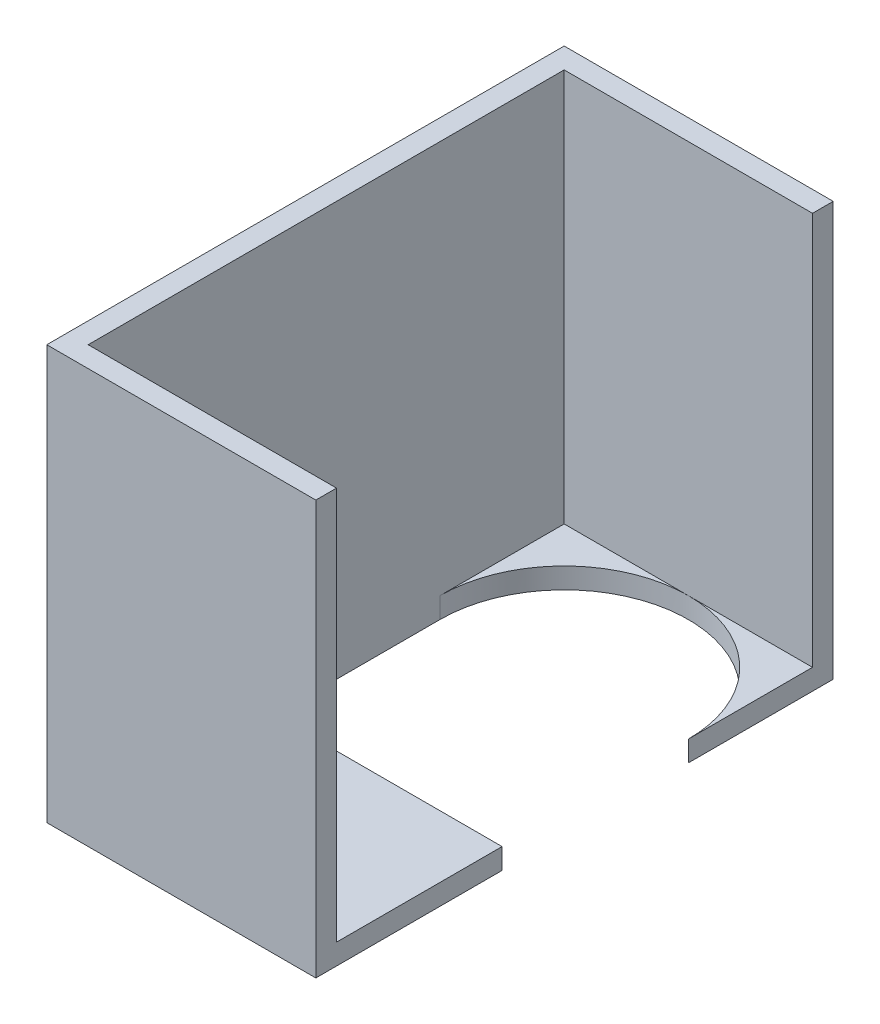
ISO-10303-21;
HEADER;
FILE_DESCRIPTION(('STEP AP214'),'2;1');
FILE_NAME('part.step','',(''),(''),'','','');
FILE_SCHEMA(('AUTOMOTIVE_DESIGN { 1 0 10303 214 1 1 1 1 }'));
ENDSEC;
DATA;
#1=APPLICATION_CONTEXT('core data for automotive mechanical design processes');
#2=APPLICATION_PROTOCOL_DEFINITION('international standard','automotive_design',2000,#1);
#3=PRODUCT_CONTEXT('',#1,'mechanical');
#4=PRODUCT('Part','Part','',(#3));
#5=PRODUCT_RELATED_PRODUCT_CATEGORY('part','',(#4));
#6=PRODUCT_DEFINITION_FORMATION('','',#4);
#7=PRODUCT_DEFINITION_CONTEXT('part definition',#1,'design');
#8=PRODUCT_DEFINITION('design','',#6,#7);
#9=PRODUCT_DEFINITION_SHAPE('','',#8);
#10=(LENGTH_UNIT() NAMED_UNIT(*) SI_UNIT(.MILLI.,.METRE.));
#11=(NAMED_UNIT(*) PLANE_ANGLE_UNIT() SI_UNIT($,.RADIAN.));
#12=(NAMED_UNIT(*) SI_UNIT($,.STERADIAN.) SOLID_ANGLE_UNIT());
#13=UNCERTAINTY_MEASURE_WITH_UNIT(LENGTH_MEASURE(1.E-05),#10,'distance_accuracy_value','');
#14=(GEOMETRIC_REPRESENTATION_CONTEXT(3) GLOBAL_UNCERTAINTY_ASSIGNED_CONTEXT((#13)) GLOBAL_UNIT_ASSIGNED_CONTEXT((#10,
#11,#12)) REPRESENTATION_CONTEXT('',''));
#15=CARTESIAN_POINT('',(0.,0.,0.));
#16=DIRECTION('',(0.,0.,1.));
#17=DIRECTION('',(1.,0.,0.));
#18=AXIS2_PLACEMENT_3D('',#15,#16,#17);
#19=CARTESIAN_POINT('',(7.,20.,12.5));
#20=DIRECTION('',(-1.,0.,0.));
#21=DIRECTION('',(0.,0.,1.));
#22=AXIS2_PLACEMENT_3D('',#19,#20,#21);
#23=PLANE('',#22);
#24=DIRECTION('',(0.,-1.,0.));
#25=VECTOR('',#24,1.);
#26=CARTESIAN_POINT('',(7.00000000000001,20.,3.50000000000001));
#27=LINE('',#26,#25);
#28=CARTESIAN_POINT('',(7.00000000000001,1.,3.50000000000001));
#29=VERTEX_POINT('',#28);
#30=CARTESIAN_POINT('',(7.00000000000001,0.,3.50000000000001));
#31=VERTEX_POINT('',#30);
#32=EDGE_CURVE('E137',#29,#31,#27,.T.);
#33=ORIENTED_EDGE('',*,*,#32,.F.);
#34=DIRECTION('',(0.,0.,-1.));
#35=VECTOR('',#34,1.);
#36=CARTESIAN_POINT('',(7.,1.,-11.5));
#37=LINE('',#36,#35);
#38=CARTESIAN_POINT('',(7.00000000000001,1.,11.5));
#39=VERTEX_POINT('',#38);
#40=EDGE_CURVE('E171',#39,#29,#37,.T.);
#41=ORIENTED_EDGE('',*,*,#40,.F.);
#42=DIRECTION('',(0.,-1.,0.));
#43=VECTOR('',#42,1.);
#44=CARTESIAN_POINT('',(7.00000000000001,20.,11.5));
#45=LINE('',#44,#43);
#46=CARTESIAN_POINT('',(7.00000000000001,20.,11.5));
#47=VERTEX_POINT('',#46);
#48=EDGE_CURVE('E180',#47,#39,#45,.T.);
#49=ORIENTED_EDGE('',*,*,#48,.F.);
#50=DIRECTION('',(0.,0.,-1.));
#51=VECTOR('',#50,1.);
#52=CARTESIAN_POINT('',(7.,20.,12.5));
#53=LINE('',#52,#51);
#54=CARTESIAN_POINT('',(7.,20.,12.5));
#55=VERTEX_POINT('',#54);
#56=EDGE_CURVE('E186',#55,#47,#53,.T.);
#57=ORIENTED_EDGE('',*,*,#56,.F.);
#58=DIRECTION('',(0.,-1.,0.));
#59=VECTOR('',#58,1.);
#60=CARTESIAN_POINT('',(7.,20.,12.5));
#61=LINE('',#60,#59);
#62=CARTESIAN_POINT('',(7.,0.,12.5));
#63=VERTEX_POINT('',#62);
#64=EDGE_CURVE('E196',#55,#63,#61,.T.);
#65=ORIENTED_EDGE('',*,*,#64,.T.);
#66=DIRECTION('',(0.,0.,-1.));
#67=VECTOR('',#66,1.);
#68=CARTESIAN_POINT('',(7.,0.,12.5));
#69=LINE('',#68,#67);
#70=EDGE_CURVE('E197',#63,#31,#69,.T.);
#71=ORIENTED_EDGE('',*,*,#70,.T.);
#72=EDGE_LOOP('',(#33,#41,#49,#57,#65,#71));
#73=FACE_BOUND('',#72,.T.);
#74=ADVANCED_FACE('F35',(#73),#23,.F.);
#75=DIRECTION('',(0.,-1.,0.));
#76=VECTOR('',#75,1.);
#77=CARTESIAN_POINT('',(7.00000000000001,20.,-5.49999999999999));
#78=LINE('',#77,#76);
#79=CARTESIAN_POINT('',(7.,1.,-5.49999999999999));
#80=VERTEX_POINT('',#79);
#81=CARTESIAN_POINT('',(7.00000000000001,0.,-5.49999999999999));
#82=VERTEX_POINT('',#81);
#83=EDGE_CURVE('E49',#80,#82,#78,.T.);
#84=ORIENTED_EDGE('',*,*,#83,.T.);
#85=CARTESIAN_POINT('',(7.,0.,-12.5));
#86=VERTEX_POINT('',#85);
#87=EDGE_CURVE('E185',#82,#86,#69,.T.);
#88=ORIENTED_EDGE('',*,*,#87,.T.);
#89=DIRECTION('',(0.,-1.,0.));
#90=VECTOR('',#89,1.);
#91=CARTESIAN_POINT('',(7.,20.,-12.5));
#92=LINE('',#91,#90);
#93=CARTESIAN_POINT('',(7.,20.,-12.5));
#94=VERTEX_POINT('',#93);
#95=EDGE_CURVE('E213',#94,#86,#92,.T.);
#96=ORIENTED_EDGE('',*,*,#95,.F.);
#97=CARTESIAN_POINT('',(7.,20.,-11.5));
#98=VERTEX_POINT('',#97);
#99=EDGE_CURVE('E190',#98,#94,#53,.T.);
#100=ORIENTED_EDGE('',*,*,#99,.F.);
#101=DIRECTION('',(0.,-1.,0.));
#102=VECTOR('',#101,1.);
#103=CARTESIAN_POINT('',(7.,20.,-11.5));
#104=LINE('',#103,#102);
#105=CARTESIAN_POINT('',(7.,1.,-11.5));
#106=VERTEX_POINT('',#105);
#107=EDGE_CURVE('E57',#98,#106,#104,.T.);
#108=ORIENTED_EDGE('',*,*,#107,.T.);
#109=EDGE_CURVE('E170',#80,#106,#37,.T.);
#110=ORIENTED_EDGE('',*,*,#109,.F.);
#111=EDGE_LOOP('',(#84,#88,#96,#100,#108,#110));
#112=FACE_BOUND('',#111,.T.);
#113=ADVANCED_FACE('F227',(#112),#23,.F.);
#114=CARTESIAN_POINT('',(0.,0.,0.));
#115=DIRECTION('',(0.,-1.,0.));
#116=DIRECTION('',(0.,0.,-1.));
#117=AXIS2_PLACEMENT_3D('',#114,#115,#116);
#118=PLANE('',#117);
#119=DIRECTION('',(0.,0.,1.));
#120=VECTOR('',#119,1.);
#121=CARTESIAN_POINT('',(-4.99999999999999,0.,3.50000000000001));
#122=LINE('',#121,#120);
#123=CARTESIAN_POINT('',(-4.99999999999999,0.,-5.49999999999999));
#124=VERTEX_POINT('',#123);
#125=CARTESIAN_POINT('',(-4.99999999999999,0.,3.50000000000001));
#126=VERTEX_POINT('',#125);
#127=EDGE_CURVE('E132',#124,#126,#122,.T.);
#128=ORIENTED_EDGE('',*,*,#127,.T.);
#129=DIRECTION('',(1.,0.,0.));
#130=VECTOR('',#129,1.);
#131=CARTESIAN_POINT('',(-4.99999999999999,0.,3.50000000000001));
#132=LINE('',#131,#130);
#133=EDGE_CURVE('E140',#126,#31,#132,.T.);
#134=ORIENTED_EDGE('',*,*,#133,.T.);
#135=ORIENTED_EDGE('',*,*,#70,.F.);
#136=DIRECTION('',(1.,0.,0.));
#137=VECTOR('',#136,1.);
#138=CARTESIAN_POINT('',(-6.,0.,12.5));
#139=LINE('',#138,#137);
#140=CARTESIAN_POINT('',(-6.,0.,12.5));
#141=VERTEX_POINT('',#140);
#142=EDGE_CURVE('E203',#141,#63,#139,.T.);
#143=ORIENTED_EDGE('',*,*,#142,.F.);
#144=DIRECTION('',(0.,0.,1.));
#145=VECTOR('',#144,1.);
#146=CARTESIAN_POINT('',(-6.,0.,12.5));
#147=LINE('',#146,#145);
#148=CARTESIAN_POINT('',(-6.,0.,-12.5));
#149=VERTEX_POINT('',#148);
#150=EDGE_CURVE('E201',#149,#141,#147,.T.);
#151=ORIENTED_EDGE('',*,*,#150,.F.);
#152=DIRECTION('',(-1.,0.,0.));
#153=VECTOR('',#152,1.);
#154=CARTESIAN_POINT('',(-6.,0.,-12.5));
#155=LINE('',#154,#153);
#156=EDGE_CURVE('E199',#86,#149,#155,.T.);
#157=ORIENTED_EDGE('',*,*,#156,.F.);
#158=ORIENTED_EDGE('',*,*,#87,.F.);
#159=CARTESIAN_POINT('',(1.00000000000001,0.,-5.49999999999999));
#160=DIRECTION('',(0.,1.,0.));
#161=DIRECTION('',(0.,0.,1.));
#162=AXIS2_PLACEMENT_3D('',#159,#160,#161);
#163=CIRCLE('',#162,6.);
#164=EDGE_CURVE('E146',#82,#124,#163,.T.);
#165=ORIENTED_EDGE('',*,*,#164,.T.);
#166=EDGE_LOOP('',(#128,#134,#135,#143,#151,#157,#158,#165));
#167=FACE_BOUND('',#166,.T.);
#168=ADVANCED_FACE('F148',(#167),#118,.T.);
#169=CARTESIAN_POINT('',(0.,1.,0.));
#170=DIRECTION('',(0.,1.,0.));
#171=DIRECTION('',(0.,0.,1.));
#172=AXIS2_PLACEMENT_3D('',#169,#170,#171);
#173=PLANE('',#172);
#174=ORIENTED_EDGE('',*,*,#40,.T.);
#175=DIRECTION('',(-1.,0.,0.));
#176=VECTOR('',#175,1.);
#177=CARTESIAN_POINT('',(0.,1.,3.50000000000001));
#178=LINE('',#177,#176);
#179=CARTESIAN_POINT('',(-4.99999999999999,1.,3.50000000000001));
#180=VERTEX_POINT('',#179);
#181=EDGE_CURVE('E11',#29,#180,#178,.T.);
#182=ORIENTED_EDGE('',*,*,#181,.T.);
#183=DIRECTION('',(0.,0.,1.));
#184=VECTOR('',#183,1.);
#185=CARTESIAN_POINT('',(-5.,1.,-11.5));
#186=LINE('',#185,#184);
#187=CARTESIAN_POINT('',(-4.99999999999999,1.,11.5));
#188=VERTEX_POINT('',#187);
#189=EDGE_CURVE('E135',#180,#188,#186,.T.);
#190=ORIENTED_EDGE('',*,*,#189,.T.);
#191=DIRECTION('',(1.,0.,0.));
#192=VECTOR('',#191,1.);
#193=CARTESIAN_POINT('',(-4.99999999999999,1.,11.5));
#194=LINE('',#193,#192);
#195=EDGE_CURVE('E168',#188,#39,#194,.T.);
#196=ORIENTED_EDGE('',*,*,#195,.T.);
#197=EDGE_LOOP('',(#174,#182,#190,#196));
#198=FACE_BOUND('',#197,.T.);
#199=ADVANCED_FACE('F271',(#198),#173,.T.);
#200=CARTESIAN_POINT('',(-5.,1.,-11.5));
#201=VERTEX_POINT('',#200);
#202=CARTESIAN_POINT('',(-4.99999999999999,1.,-5.49999999999999));
#203=VERTEX_POINT('',#202);
#204=EDGE_CURVE('E165',#201,#203,#186,.T.);
#205=ORIENTED_EDGE('',*,*,#204,.T.);
#206=CARTESIAN_POINT('',(1.00000000000001,1.,-5.49999999999999));
#207=DIRECTION('',(0.,1.,0.));
#208=DIRECTION('',(0.,0.,1.));
#209=AXIS2_PLACEMENT_3D('',#206,#207,#208);
#210=CIRCLE('',#209,6.);
#211=CARTESIAN_POINT('',(1.00000000000001,1.,-11.5));
#212=VERTEX_POINT('',#211);
#213=EDGE_CURVE('E42',#203,#212,#210,.F.);
#214=ORIENTED_EDGE('',*,*,#213,.T.);
#215=DIRECTION('',(-1.,0.,0.));
#216=VECTOR('',#215,1.);
#217=CARTESIAN_POINT('',(-5.,1.,-11.5));
#218=LINE('',#217,#216);
#219=EDGE_CURVE('E174',#212,#201,#218,.T.);
#220=ORIENTED_EDGE('',*,*,#219,.T.);
#221=EDGE_LOOP('',(#205,#214,#220));
#222=FACE_BOUND('',#221,.T.);
#223=ADVANCED_FACE('F221',(#222),#173,.T.);
#224=EDGE_CURVE('E160',#106,#212,#218,.T.);
#225=ORIENTED_EDGE('',*,*,#224,.T.);
#226=EDGE_CURVE('E215',#212,#80,#210,.F.);
#227=ORIENTED_EDGE('',*,*,#226,.T.);
#228=ORIENTED_EDGE('',*,*,#109,.T.);
#229=EDGE_LOOP('',(#225,#227,#228));
#230=FACE_BOUND('',#229,.T.);
#231=ADVANCED_FACE('F225',(#230),#173,.T.);
#232=CARTESIAN_POINT('',(0.,20.,0.));
#233=DIRECTION('',(0.,-1.,0.));
#234=DIRECTION('',(0.,0.,-1.));
#235=AXIS2_PLACEMENT_3D('',#232,#233,#234);
#236=PLANE('',#235);
#237=DIRECTION('',(1.,0.,0.));
#238=VECTOR('',#237,1.);
#239=CARTESIAN_POINT('',(-4.99999999999999,20.,11.5));
#240=LINE('',#239,#238);
#241=CARTESIAN_POINT('',(-4.99999999999999,20.,11.5));
#242=VERTEX_POINT('',#241);
#243=EDGE_CURVE('E159',#242,#47,#240,.T.);
#244=ORIENTED_EDGE('',*,*,#243,.F.);
#245=DIRECTION('',(0.,0.,1.));
#246=VECTOR('',#245,1.);
#247=CARTESIAN_POINT('',(-5.,20.,-11.5));
#248=LINE('',#247,#246);
#249=CARTESIAN_POINT('',(-5.,20.,-11.5));
#250=VERTEX_POINT('',#249);
#251=EDGE_CURVE('E157',#250,#242,#248,.T.);
#252=ORIENTED_EDGE('',*,*,#251,.F.);
#253=DIRECTION('',(-1.,0.,0.));
#254=VECTOR('',#253,1.);
#255=CARTESIAN_POINT('',(-5.,20.,-11.5));
#256=LINE('',#255,#254);
#257=EDGE_CURVE('E162',#98,#250,#256,.T.);
#258=ORIENTED_EDGE('',*,*,#257,.F.);
#259=ORIENTED_EDGE('',*,*,#99,.T.);
#260=DIRECTION('',(-1.,0.,0.));
#261=VECTOR('',#260,1.);
#262=CARTESIAN_POINT('',(-6.,20.,-12.5));
#263=LINE('',#262,#261);
#264=CARTESIAN_POINT('',(-6.,20.,-12.5));
#265=VERTEX_POINT('',#264);
#266=EDGE_CURVE('E189',#94,#265,#263,.T.);
#267=ORIENTED_EDGE('',*,*,#266,.T.);
#268=DIRECTION('',(0.,0.,1.));
#269=VECTOR('',#268,1.);
#270=CARTESIAN_POINT('',(-6.,20.,12.5));
#271=LINE('',#270,#269);
#272=CARTESIAN_POINT('',(-6.,20.,12.5));
#273=VERTEX_POINT('',#272);
#274=EDGE_CURVE('E192',#265,#273,#271,.T.);
#275=ORIENTED_EDGE('',*,*,#274,.T.);
#276=DIRECTION('',(1.,0.,0.));
#277=VECTOR('',#276,1.);
#278=CARTESIAN_POINT('',(-6.,20.,12.5));
#279=LINE('',#278,#277);
#280=EDGE_CURVE('E194',#273,#55,#279,.T.);
#281=ORIENTED_EDGE('',*,*,#280,.T.);
#282=ORIENTED_EDGE('',*,*,#56,.T.);
#283=EDGE_LOOP('',(#244,#252,#258,#259,#267,#275,#281,#282));
#284=FACE_BOUND('',#283,.T.);
#285=ADVANCED_FACE('F233',(#284),#236,.F.);
#286=CARTESIAN_POINT('',(-6.,20.,-12.5));
#287=DIRECTION('',(0.,0.,1.));
#288=DIRECTION('',(1.,0.,0.));
#289=AXIS2_PLACEMENT_3D('',#286,#287,#288);
#290=PLANE('',#289);
#291=ORIENTED_EDGE('',*,*,#156,.T.);
#292=DIRECTION('',(0.,-1.,0.));
#293=VECTOR('',#292,1.);
#294=CARTESIAN_POINT('',(-6.,20.,-12.5));
#295=LINE('',#294,#293);
#296=EDGE_CURVE('E210',#265,#149,#295,.T.);
#297=ORIENTED_EDGE('',*,*,#296,.F.);
#298=ORIENTED_EDGE('',*,*,#266,.F.);
#299=ORIENTED_EDGE('',*,*,#95,.T.);
#300=EDGE_LOOP('',(#291,#297,#298,#299));
#301=FACE_BOUND('',#300,.T.);
#302=ADVANCED_FACE('F237',(#301),#290,.F.);
#303=CARTESIAN_POINT('',(-6.,20.,12.5));
#304=DIRECTION('',(1.,0.,0.));
#305=DIRECTION('',(0.,0.,-1.));
#306=AXIS2_PLACEMENT_3D('',#303,#304,#305);
#307=PLANE('',#306);
#308=ORIENTED_EDGE('',*,*,#150,.T.);
#309=DIRECTION('',(0.,-1.,0.));
#310=VECTOR('',#309,1.);
#311=CARTESIAN_POINT('',(-6.,20.,12.5));
#312=LINE('',#311,#310);
#313=EDGE_CURVE('E207',#273,#141,#312,.T.);
#314=ORIENTED_EDGE('',*,*,#313,.F.);
#315=ORIENTED_EDGE('',*,*,#274,.F.);
#316=ORIENTED_EDGE('',*,*,#296,.T.);
#317=EDGE_LOOP('',(#308,#314,#315,#316));
#318=FACE_BOUND('',#317,.T.);
#319=ADVANCED_FACE('F243',(#318),#307,.F.);
#320=CARTESIAN_POINT('',(-6.,20.,12.5));
#321=DIRECTION('',(0.,0.,-1.));
#322=DIRECTION('',(-1.,0.,0.));
#323=AXIS2_PLACEMENT_3D('',#320,#321,#322);
#324=PLANE('',#323);
#325=ORIENTED_EDGE('',*,*,#142,.T.);
#326=ORIENTED_EDGE('',*,*,#64,.F.);
#327=ORIENTED_EDGE('',*,*,#280,.F.);
#328=ORIENTED_EDGE('',*,*,#313,.T.);
#329=EDGE_LOOP('',(#325,#326,#327,#328));
#330=FACE_BOUND('',#329,.T.);
#331=ADVANCED_FACE('F248',(#330),#324,.F.);
#332=CARTESIAN_POINT('',(-5.,20.,-11.5));
#333=DIRECTION('',(1.,0.,0.));
#334=DIRECTION('',(0.,0.,-1.));
#335=AXIS2_PLACEMENT_3D('',#332,#333,#334);
#336=PLANE('',#335);
#337=ORIENTED_EDGE('',*,*,#251,.T.);
#338=DIRECTION('',(0.,-1.,0.));
#339=VECTOR('',#338,1.);
#340=CARTESIAN_POINT('',(-4.99999999999999,20.,11.5));
#341=LINE('',#340,#339);
#342=EDGE_CURVE('E183',#242,#188,#341,.T.);
#343=ORIENTED_EDGE('',*,*,#342,.T.);
#344=ORIENTED_EDGE('',*,*,#189,.F.);
#345=DIRECTION('',(0.,-1.,0.));
#346=VECTOR('',#345,1.);
#347=CARTESIAN_POINT('',(-4.99999999999999,20.,3.50000000000001));
#348=LINE('',#347,#346);
#349=EDGE_CURVE('E127',#180,#126,#348,.T.);
#350=ORIENTED_EDGE('',*,*,#349,.T.);
#351=ORIENTED_EDGE('',*,*,#127,.F.);
#352=DIRECTION('',(0.,-1.,0.));
#353=VECTOR('',#352,1.);
#354=CARTESIAN_POINT('',(-4.99999999999999,20.,-5.49999999999999));
#355=LINE('',#354,#353);
#356=EDGE_CURVE('E153',#203,#124,#355,.T.);
#357=ORIENTED_EDGE('',*,*,#356,.F.);
#358=ORIENTED_EDGE('',*,*,#204,.F.);
#359=DIRECTION('',(0.,-1.,0.));
#360=VECTOR('',#359,1.);
#361=CARTESIAN_POINT('',(-5.,20.,-11.5));
#362=LINE('',#361,#360);
#363=EDGE_CURVE('E164',#250,#201,#362,.T.);
#364=ORIENTED_EDGE('',*,*,#363,.F.);
#365=EDGE_LOOP('',(#337,#343,#344,#350,#351,#357,#358,#364));
#366=FACE_BOUND('',#365,.T.);
#367=ADVANCED_FACE('F129',(#366),#336,.T.);
#368=CARTESIAN_POINT('',(-4.99999999999999,20.,11.5));
#369=DIRECTION('',(0.,0.,-1.));
#370=DIRECTION('',(-1.,0.,0.));
#371=AXIS2_PLACEMENT_3D('',#368,#369,#370);
#372=PLANE('',#371);
#373=ORIENTED_EDGE('',*,*,#195,.F.);
#374=ORIENTED_EDGE('',*,*,#342,.F.);
#375=ORIENTED_EDGE('',*,*,#243,.T.);
#376=ORIENTED_EDGE('',*,*,#48,.T.);
#377=EDGE_LOOP('',(#373,#374,#375,#376));
#378=FACE_BOUND('',#377,.T.);
#379=ADVANCED_FACE('F255',(#378),#372,.T.);
#380=CARTESIAN_POINT('',(-5.,20.,-11.5));
#381=DIRECTION('',(0.,0.,1.));
#382=DIRECTION('',(1.,0.,0.));
#383=AXIS2_PLACEMENT_3D('',#380,#381,#382);
#384=PLANE('',#383);
#385=ORIENTED_EDGE('',*,*,#257,.T.);
#386=ORIENTED_EDGE('',*,*,#363,.T.);
#387=ORIENTED_EDGE('',*,*,#219,.F.);
#388=ORIENTED_EDGE('',*,*,#224,.F.);
#389=ORIENTED_EDGE('',*,*,#107,.F.);
#390=EDGE_LOOP('',(#385,#386,#387,#388,#389));
#391=FACE_BOUND('',#390,.T.);
#392=ADVANCED_FACE('F223',(#391),#384,.T.);
#393=CARTESIAN_POINT('',(-4.99999999999999,20.,3.50000000000001));
#394=DIRECTION('',(0.,0.,-1.));
#395=DIRECTION('',(-1.,0.,0.));
#396=AXIS2_PLACEMENT_3D('',#393,#394,#395);
#397=PLANE('',#396);
#398=ORIENTED_EDGE('',*,*,#32,.T.);
#399=ORIENTED_EDGE('',*,*,#133,.F.);
#400=ORIENTED_EDGE('',*,*,#349,.F.);
#401=ORIENTED_EDGE('',*,*,#181,.F.);
#402=EDGE_LOOP('',(#398,#399,#400,#401));
#403=FACE_BOUND('',#402,.T.);
#404=ADVANCED_FACE('F141',(#403),#397,.T.);
#405=CARTESIAN_POINT('',(1.00000000000001,20.,-5.49999999999999));
#406=DIRECTION('',(0.,-1.,0.));
#407=DIRECTION('',(0.,0.,-1.));
#408=AXIS2_PLACEMENT_3D('',#405,#406,#407);
#409=CYLINDRICAL_SURFACE('',#408,6.);
#410=ORIENTED_EDGE('',*,*,#356,.T.);
#411=ORIENTED_EDGE('',*,*,#164,.F.);
#412=ORIENTED_EDGE('',*,*,#83,.F.);
#413=ORIENTED_EDGE('',*,*,#226,.F.);
#414=ORIENTED_EDGE('',*,*,#213,.F.);
#415=EDGE_LOOP('',(#410,#411,#412,#413,#414));
#416=FACE_BOUND('',#415,.T.);
#417=ADVANCED_FACE('F257',(#416),#409,.F.);
#418=CLOSED_SHELL('',(#74,#113,#168,#199,#223,#231,#285,#302,#319,#331,#367,#379,#392,#404,#417));
#419=MANIFOLD_SOLID_BREP('B2',#418);
#420=ADVANCED_BREP_SHAPE_REPRESENTATION('',(#18,#419),#14);
#421=SHAPE_DEFINITION_REPRESENTATION(#9,#420);
ENDSEC;
END-ISO-10303-21;
